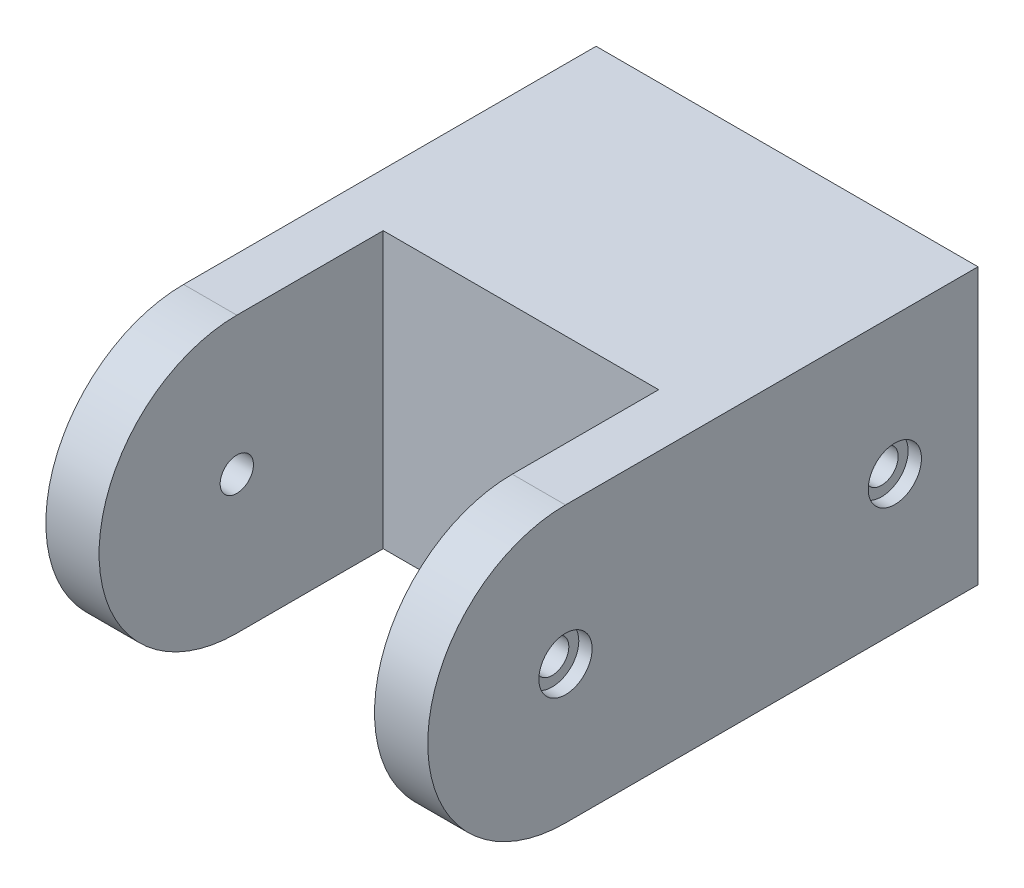
ISO-10303-21;
HEADER;
FILE_DESCRIPTION(('STEP AP214'),'2;1');
FILE_NAME('part.step','',(''),(''),'','','');
FILE_SCHEMA(('AUTOMOTIVE_DESIGN { 1 0 10303 214 1 1 1 1 }'));
ENDSEC;
DATA;
#1=APPLICATION_CONTEXT('core data for automotive mechanical design processes');
#2=APPLICATION_PROTOCOL_DEFINITION('international standard','automotive_design',2000,#1);
#3=PRODUCT_CONTEXT('',#1,'mechanical');
#4=PRODUCT('Part','Part','',(#3));
#5=PRODUCT_RELATED_PRODUCT_CATEGORY('part','',(#4));
#6=PRODUCT_DEFINITION_FORMATION('','',#4);
#7=PRODUCT_DEFINITION_CONTEXT('part definition',#1,'design');
#8=PRODUCT_DEFINITION('design','',#6,#7);
#9=PRODUCT_DEFINITION_SHAPE('','',#8);
#10=(LENGTH_UNIT() NAMED_UNIT(*) SI_UNIT(.MILLI.,.METRE.));
#11=(NAMED_UNIT(*) PLANE_ANGLE_UNIT() SI_UNIT($,.RADIAN.));
#12=(NAMED_UNIT(*) SI_UNIT($,.STERADIAN.) SOLID_ANGLE_UNIT());
#13=UNCERTAINTY_MEASURE_WITH_UNIT(LENGTH_MEASURE(1.E-05),#10,'distance_accuracy_value','');
#14=(GEOMETRIC_REPRESENTATION_CONTEXT(3) GLOBAL_UNCERTAINTY_ASSIGNED_CONTEXT((#13)) GLOBAL_UNIT_ASSIGNED_CONTEXT((#10,
#11,#12)) REPRESENTATION_CONTEXT('',''));
#15=CARTESIAN_POINT('',(0.,0.,0.));
#16=DIRECTION('',(0.,0.,1.));
#17=DIRECTION('',(1.,0.,0.));
#18=AXIS2_PLACEMENT_3D('',#15,#16,#17);
#19=CARTESIAN_POINT('',(-35.7710678118655,0.,62.));
#20=DIRECTION('',(1.,0.,0.));
#21=DIRECTION('',(0.,0.,-1.));
#22=AXIS2_PLACEMENT_3D('',#19,#20,#21);
#23=CYLINDRICAL_SURFACE('',#22,2.5);
#24=CARTESIAN_POINT('',(20.7,0.,62.));
#25=DIRECTION('',(-1.,0.,0.));
#26=DIRECTION('',(0.,0.,1.));
#27=AXIS2_PLACEMENT_3D('',#24,#25,#26);
#28=CIRCLE('',#27,2.5);
#29=CARTESIAN_POINT('',(20.7,0.,64.5));
#30=VERTEX_POINT('',#29);
#31=EDGE_CURVE('E154',#30,#30,#28,.T.);
#32=ORIENTED_EDGE('',*,*,#31,.T.);
#33=EDGE_LOOP('',(#32));
#34=FACE_BOUND('',#33,.T.);
#35=CARTESIAN_POINT('',(26.7,0.,62.));
#36=DIRECTION('',(1.,0.,0.));
#37=DIRECTION('',(0.,0.,-1.));
#38=AXIS2_PLACEMENT_3D('',#35,#36,#37);
#39=CIRCLE('',#38,2.5);
#40=CARTESIAN_POINT('',(26.7,0.,59.5));
#41=VERTEX_POINT('',#40);
#42=EDGE_CURVE('E36',#41,#41,#39,.F.);
#43=ORIENTED_EDGE('',*,*,#42,.F.);
#44=EDGE_LOOP('',(#43));
#45=FACE_BOUND('',#44,.T.);
#46=ADVANCED_FACE('F32',(#34,#45),#23,.F.);
#47=CARTESIAN_POINT('',(-35.7710678118655,0.,12.5));
#48=DIRECTION('',(1.,0.,0.));
#49=DIRECTION('',(0.,0.,-1.));
#50=AXIS2_PLACEMENT_3D('',#47,#48,#49);
#51=CYLINDRICAL_SURFACE('',#50,2.5);
#52=CARTESIAN_POINT('',(12.7,0.,12.5));
#53=DIRECTION('',(-1.,0.,0.));
#54=DIRECTION('',(0.,-1.,0.));
#55=AXIS2_PLACEMENT_3D('',#52,#53,#54);
#56=CIRCLE('',#55,2.5);
#57=CARTESIAN_POINT('',(12.7,-2.5,12.5));
#58=VERTEX_POINT('',#57);
#59=EDGE_CURVE('E229',#58,#58,#56,.T.);
#60=ORIENTED_EDGE('',*,*,#59,.T.);
#61=EDGE_LOOP('',(#60));
#62=FACE_BOUND('',#61,.T.);
#63=CARTESIAN_POINT('',(26.7,0.,12.5));
#64=DIRECTION('',(1.,0.,0.));
#65=DIRECTION('',(0.,0.,-1.));
#66=AXIS2_PLACEMENT_3D('',#63,#64,#65);
#67=CIRCLE('',#66,2.5);
#68=CARTESIAN_POINT('',(26.7,0.,10.));
#69=VERTEX_POINT('',#68);
#70=EDGE_CURVE('E239',#69,#69,#67,.F.);
#71=ORIENTED_EDGE('',*,*,#70,.F.);
#72=EDGE_LOOP('',(#71));
#73=FACE_BOUND('',#72,.T.);
#74=ADVANCED_FACE('F302',(#62,#73),#51,.F.);
#75=CARTESIAN_POINT('',(-20.7,0.,62.));
#76=DIRECTION('',(1.,0.,0.));
#77=DIRECTION('',(0.,0.,-1.));
#78=AXIS2_PLACEMENT_3D('',#75,#76,#77);
#79=CIRCLE('',#78,2.5);
#80=CARTESIAN_POINT('',(-20.7,0.,59.5));
#81=VERTEX_POINT('',#80);
#82=EDGE_CURVE('E226',#81,#81,#79,.T.);
#83=ORIENTED_EDGE('',*,*,#82,.T.);
#84=EDGE_LOOP('',(#83));
#85=FACE_BOUND('',#84,.T.);
#86=CARTESIAN_POINT('',(-26.7,0.,62.));
#87=DIRECTION('',(-1.,0.,0.));
#88=DIRECTION('',(0.,0.,1.));
#89=AXIS2_PLACEMENT_3D('',#86,#87,#88);
#90=CIRCLE('',#89,2.5);
#91=CARTESIAN_POINT('',(-26.7,0.,64.5));
#92=VERTEX_POINT('',#91);
#93=EDGE_CURVE('E233',#92,#92,#90,.F.);
#94=ORIENTED_EDGE('',*,*,#93,.F.);
#95=EDGE_LOOP('',(#94));
#96=FACE_BOUND('',#95,.T.);
#97=ADVANCED_FACE('F305',(#85,#96),#23,.F.);
#98=CARTESIAN_POINT('',(-12.7,0.,12.5));
#99=DIRECTION('',(1.,0.,0.));
#100=DIRECTION('',(0.,1.,0.));
#101=AXIS2_PLACEMENT_3D('',#98,#99,#100);
#102=CIRCLE('',#101,2.5);
#103=CARTESIAN_POINT('',(-12.7,2.5,12.5));
#104=VERTEX_POINT('',#103);
#105=EDGE_CURVE('E230',#104,#104,#102,.T.);
#106=ORIENTED_EDGE('',*,*,#105,.T.);
#107=EDGE_LOOP('',(#106));
#108=FACE_BOUND('',#107,.T.);
#109=CARTESIAN_POINT('',(-26.7,0.,12.5));
#110=DIRECTION('',(-1.,0.,0.));
#111=DIRECTION('',(0.,0.,1.));
#112=AXIS2_PLACEMENT_3D('',#109,#110,#111);
#113=CIRCLE('',#112,2.5);
#114=CARTESIAN_POINT('',(-26.7,0.,15.));
#115=VERTEX_POINT('',#114);
#116=EDGE_CURVE('E234',#115,#115,#113,.F.);
#117=ORIENTED_EDGE('',*,*,#116,.F.);
#118=EDGE_LOOP('',(#117));
#119=FACE_BOUND('',#118,.T.);
#120=ADVANCED_FACE('F311',(#108,#119),#51,.F.);
#121=CARTESIAN_POINT('',(0.,0.,40.));
#122=DIRECTION('',(0.,0.,1.));
#123=DIRECTION('',(1.,0.,0.));
#124=AXIS2_PLACEMENT_3D('',#121,#122,#123);
#125=PLANE('',#124);
#126=DIRECTION('',(0.,-1.,0.));
#127=VECTOR('',#126,1.);
#128=CARTESIAN_POINT('',(-20.7,20.7,40.));
#129=LINE('',#128,#127);
#130=CARTESIAN_POINT('',(-20.7,20.7,40.));
#131=VERTEX_POINT('',#130);
#132=CARTESIAN_POINT('',(-20.7,-20.7,40.));
#133=VERTEX_POINT('',#132);
#134=EDGE_CURVE('E136',#131,#133,#129,.T.);
#135=ORIENTED_EDGE('',*,*,#134,.T.);
#136=DIRECTION('',(1.,0.,0.));
#137=VECTOR('',#136,1.);
#138=CARTESIAN_POINT('',(-28.7,-20.7,40.));
#139=LINE('',#138,#137);
#140=CARTESIAN_POINT('',(20.7,-20.7,40.));
#141=VERTEX_POINT('',#140);
#142=EDGE_CURVE('E126',#133,#141,#139,.T.);
#143=ORIENTED_EDGE('',*,*,#142,.T.);
#144=DIRECTION('',(0.,1.,0.));
#145=VECTOR('',#144,1.);
#146=CARTESIAN_POINT('',(20.7,-20.7,40.));
#147=LINE('',#146,#145);
#148=CARTESIAN_POINT('',(20.7,20.7,40.));
#149=VERTEX_POINT('',#148);
#150=EDGE_CURVE('E161',#141,#149,#147,.T.);
#151=ORIENTED_EDGE('',*,*,#150,.T.);
#152=DIRECTION('',(-1.,0.,0.));
#153=VECTOR('',#152,1.);
#154=CARTESIAN_POINT('',(-28.7,20.7,40.));
#155=LINE('',#154,#153);
#156=EDGE_CURVE('E49',#149,#131,#155,.T.);
#157=ORIENTED_EDGE('',*,*,#156,.T.);
#158=EDGE_LOOP('',(#135,#143,#151,#157));
#159=FACE_BOUND('',#158,.T.);
#160=ADVANCED_FACE('F137',(#159),#125,.T.);
#161=CARTESIAN_POINT('',(0.,0.,0.));
#162=DIRECTION('',(0.,0.,1.));
#163=DIRECTION('',(1.,0.,0.));
#164=AXIS2_PLACEMENT_3D('',#161,#162,#163);
#165=PLANE('',#164);
#166=DIRECTION('',(0.,1.,0.));
#167=VECTOR('',#166,1.);
#168=CARTESIAN_POINT('',(28.7,20.7,0.));
#169=LINE('',#168,#167);
#170=CARTESIAN_POINT('',(28.7,-20.7,0.));
#171=VERTEX_POINT('',#170);
#172=CARTESIAN_POINT('',(28.7,20.7,0.));
#173=VERTEX_POINT('',#172);
#174=EDGE_CURVE('E209',#171,#173,#169,.T.);
#175=ORIENTED_EDGE('',*,*,#174,.F.);
#176=DIRECTION('',(1.,0.,0.));
#177=VECTOR('',#176,1.);
#178=CARTESIAN_POINT('',(-28.7,-20.7,0.));
#179=LINE('',#178,#177);
#180=CARTESIAN_POINT('',(-28.7,-20.7,0.));
#181=VERTEX_POINT('',#180);
#182=EDGE_CURVE('E216',#181,#171,#179,.T.);
#183=ORIENTED_EDGE('',*,*,#182,.F.);
#184=DIRECTION('',(0.,-1.,0.));
#185=VECTOR('',#184,1.);
#186=CARTESIAN_POINT('',(-28.7,20.7,0.));
#187=LINE('',#186,#185);
#188=CARTESIAN_POINT('',(-28.7,20.7,0.));
#189=VERTEX_POINT('',#188);
#190=EDGE_CURVE('E214',#189,#181,#187,.T.);
#191=ORIENTED_EDGE('',*,*,#190,.F.);
#192=DIRECTION('',(-1.,0.,0.));
#193=VECTOR('',#192,1.);
#194=CARTESIAN_POINT('',(-28.7,20.7,0.));
#195=LINE('',#194,#193);
#196=EDGE_CURVE('E212',#173,#189,#195,.T.);
#197=ORIENTED_EDGE('',*,*,#196,.F.);
#198=EDGE_LOOP('',(#175,#183,#191,#197));
#199=FACE_BOUND('',#198,.T.);
#200=DIRECTION('',(0.,1.,0.));
#201=VECTOR('',#200,1.);
#202=CARTESIAN_POINT('',(12.7,12.7,0.));
#203=LINE('',#202,#201);
#204=CARTESIAN_POINT('',(12.7,-12.7,0.));
#205=VERTEX_POINT('',#204);
#206=CARTESIAN_POINT('',(12.7,12.7,0.));
#207=VERTEX_POINT('',#206);
#208=EDGE_CURVE('E134',#205,#207,#203,.T.);
#209=ORIENTED_EDGE('',*,*,#208,.T.);
#210=DIRECTION('',(-1.,0.,0.));
#211=VECTOR('',#210,1.);
#212=CARTESIAN_POINT('',(-12.7,12.7,0.));
#213=LINE('',#212,#211);
#214=CARTESIAN_POINT('',(-12.7,12.7,0.));
#215=VERTEX_POINT('',#214);
#216=EDGE_CURVE('E192',#207,#215,#213,.T.);
#217=ORIENTED_EDGE('',*,*,#216,.T.);
#218=DIRECTION('',(0.,-1.,0.));
#219=VECTOR('',#218,1.);
#220=CARTESIAN_POINT('',(-12.7,12.7,0.));
#221=LINE('',#220,#219);
#222=CARTESIAN_POINT('',(-12.7,-12.7,0.));
#223=VERTEX_POINT('',#222);
#224=EDGE_CURVE('E195',#215,#223,#221,.T.);
#225=ORIENTED_EDGE('',*,*,#224,.T.);
#226=DIRECTION('',(1.,0.,0.));
#227=VECTOR('',#226,1.);
#228=CARTESIAN_POINT('',(-12.7,-12.7,0.));
#229=LINE('',#228,#227);
#230=EDGE_CURVE('E180',#223,#205,#229,.T.);
#231=ORIENTED_EDGE('',*,*,#230,.T.);
#232=EDGE_LOOP('',(#209,#217,#225,#231));
#233=FACE_BOUND('',#232,.T.);
#234=ADVANCED_FACE('F283',(#199,#233),#165,.F.);
#235=CARTESIAN_POINT('',(28.7,20.7,30.));
#236=DIRECTION('',(-1.,0.,0.));
#237=DIRECTION('',(0.,0.,1.));
#238=AXIS2_PLACEMENT_3D('',#235,#236,#237);
#239=PLANE('',#238);
#240=CARTESIAN_POINT('',(28.7,0.,62.));
#241=DIRECTION('',(1.,0.,0.));
#242=DIRECTION('',(0.,0.,-1.));
#243=AXIS2_PLACEMENT_3D('',#240,#241,#242);
#244=CIRCLE('',#243,4.00000000000001);
#245=CARTESIAN_POINT('',(28.7,0.,58.));
#246=VERTEX_POINT('',#245);
#247=EDGE_CURVE('E247',#246,#246,#244,.T.);
#248=ORIENTED_EDGE('',*,*,#247,.F.);
#249=EDGE_LOOP('',(#248));
#250=FACE_BOUND('',#249,.T.);
#251=CARTESIAN_POINT('',(28.7,0.,12.5));
#252=DIRECTION('',(1.,0.,0.));
#253=DIRECTION('',(0.,0.,-1.));
#254=AXIS2_PLACEMENT_3D('',#251,#252,#253);
#255=CIRCLE('',#254,4.);
#256=CARTESIAN_POINT('',(28.7,0.,8.5));
#257=VERTEX_POINT('',#256);
#258=EDGE_CURVE('E257',#257,#257,#255,.T.);
#259=ORIENTED_EDGE('',*,*,#258,.F.);
#260=EDGE_LOOP('',(#259));
#261=FACE_BOUND('',#260,.T.);
#262=ORIENTED_EDGE('',*,*,#174,.T.);
#263=DIRECTION('',(0.,0.,-1.));
#264=VECTOR('',#263,1.);
#265=CARTESIAN_POINT('',(28.7,20.7,30.));
#266=LINE('',#265,#264);
#267=CARTESIAN_POINT('',(28.7,20.7,62.));
#268=VERTEX_POINT('',#267);
#269=EDGE_CURVE('E11',#268,#173,#266,.T.);
#270=ORIENTED_EDGE('',*,*,#269,.F.);
#271=CARTESIAN_POINT('',(28.7,0.,62.));
#272=DIRECTION('',(1.,0.,0.));
#273=DIRECTION('',(0.,0.,1.));
#274=AXIS2_PLACEMENT_3D('',#271,#272,#273);
#275=CIRCLE('',#274,20.7);
#276=CARTESIAN_POINT('',(28.7,-20.7,62.));
#277=VERTEX_POINT('',#276);
#278=EDGE_CURVE('E158',#268,#277,#275,.T.);
#279=ORIENTED_EDGE('',*,*,#278,.T.);
#280=DIRECTION('',(0.,0.,-1.));
#281=VECTOR('',#280,1.);
#282=CARTESIAN_POINT('',(28.7,-20.7,30.));
#283=LINE('',#282,#281);
#284=EDGE_CURVE('E218',#277,#171,#283,.T.);
#285=ORIENTED_EDGE('',*,*,#284,.T.);
#286=EDGE_LOOP('',(#262,#270,#279,#285));
#287=FACE_BOUND('',#286,.T.);
#288=ADVANCED_FACE('F34',(#250,#261,#287),#239,.F.);
#289=CARTESIAN_POINT('',(-28.7,20.7,30.));
#290=DIRECTION('',(0.,-1.,0.));
#291=DIRECTION('',(0.,0.,-1.));
#292=AXIS2_PLACEMENT_3D('',#289,#290,#291);
#293=PLANE('',#292);
#294=ORIENTED_EDGE('',*,*,#196,.T.);
#295=DIRECTION('',(0.,0.,-1.));
#296=VECTOR('',#295,1.);
#297=CARTESIAN_POINT('',(-28.7,20.7,30.));
#298=LINE('',#297,#296);
#299=CARTESIAN_POINT('',(-28.7,20.7,62.));
#300=VERTEX_POINT('',#299);
#301=EDGE_CURVE('E41',#300,#189,#298,.T.);
#302=ORIENTED_EDGE('',*,*,#301,.F.);
#303=DIRECTION('',(-1.,0.,0.));
#304=VECTOR('',#303,1.);
#305=CARTESIAN_POINT('',(-20.7,20.7,62.));
#306=LINE('',#305,#304);
#307=CARTESIAN_POINT('',(-20.7,20.7,62.));
#308=VERTEX_POINT('',#307);
#309=EDGE_CURVE('E155',#308,#300,#306,.T.);
#310=ORIENTED_EDGE('',*,*,#309,.F.);
#311=DIRECTION('',(0.,0.,-1.));
#312=VECTOR('',#311,1.);
#313=CARTESIAN_POINT('',(-20.7,20.7,40.));
#314=LINE('',#313,#312);
#315=EDGE_CURVE('E141',#308,#131,#314,.T.);
#316=ORIENTED_EDGE('',*,*,#315,.T.);
#317=ORIENTED_EDGE('',*,*,#156,.F.);
#318=DIRECTION('',(0.,0.,1.));
#319=VECTOR('',#318,1.);
#320=CARTESIAN_POINT('',(20.7,20.7,40.));
#321=LINE('',#320,#319);
#322=CARTESIAN_POINT('',(20.7,20.7,62.));
#323=VERTEX_POINT('',#322);
#324=EDGE_CURVE('E57',#149,#323,#321,.T.);
#325=ORIENTED_EDGE('',*,*,#324,.T.);
#326=DIRECTION('',(1.,0.,0.));
#327=VECTOR('',#326,1.);
#328=CARTESIAN_POINT('',(20.7,20.7,62.));
#329=LINE('',#328,#327);
#330=EDGE_CURVE('E167',#323,#268,#329,.T.);
#331=ORIENTED_EDGE('',*,*,#330,.T.);
#332=ORIENTED_EDGE('',*,*,#269,.T.);
#333=EDGE_LOOP('',(#294,#302,#310,#316,#317,#325,#331,#332));
#334=FACE_BOUND('',#333,.T.);
#335=ADVANCED_FACE('F274',(#334),#293,.F.);
#336=CARTESIAN_POINT('',(-28.7,20.7,30.));
#337=DIRECTION('',(1.,0.,0.));
#338=DIRECTION('',(0.,0.,-1.));
#339=AXIS2_PLACEMENT_3D('',#336,#337,#338);
#340=PLANE('',#339);
#341=CARTESIAN_POINT('',(-28.7,0.,62.));
#342=DIRECTION('',(-1.,0.,0.));
#343=DIRECTION('',(0.,0.,1.));
#344=AXIS2_PLACEMENT_3D('',#341,#342,#343);
#345=CIRCLE('',#344,4.00000000000001);
#346=CARTESIAN_POINT('',(-28.7,0.,66.));
#347=VERTEX_POINT('',#346);
#348=EDGE_CURVE('E262',#347,#347,#345,.T.);
#349=ORIENTED_EDGE('',*,*,#348,.F.);
#350=EDGE_LOOP('',(#349));
#351=FACE_BOUND('',#350,.T.);
#352=CARTESIAN_POINT('',(-28.7,0.,12.5));
#353=DIRECTION('',(-1.,0.,0.));
#354=DIRECTION('',(0.,0.,1.));
#355=AXIS2_PLACEMENT_3D('',#352,#353,#354);
#356=CIRCLE('',#355,4.);
#357=CARTESIAN_POINT('',(-28.7,0.,16.5));
#358=VERTEX_POINT('',#357);
#359=EDGE_CURVE('E245',#358,#358,#356,.T.);
#360=ORIENTED_EDGE('',*,*,#359,.F.);
#361=EDGE_LOOP('',(#360));
#362=FACE_BOUND('',#361,.T.);
#363=ORIENTED_EDGE('',*,*,#190,.T.);
#364=DIRECTION('',(0.,0.,-1.));
#365=VECTOR('',#364,1.);
#366=CARTESIAN_POINT('',(-28.7,-20.7,30.));
#367=LINE('',#366,#365);
#368=CARTESIAN_POINT('',(-28.7,-20.7,62.));
#369=VERTEX_POINT('',#368);
#370=EDGE_CURVE('E221',#369,#181,#367,.T.);
#371=ORIENTED_EDGE('',*,*,#370,.F.);
#372=CARTESIAN_POINT('',(-28.7,0.,62.));
#373=DIRECTION('',(-1.,0.,0.));
#374=DIRECTION('',(0.,0.,-1.));
#375=AXIS2_PLACEMENT_3D('',#372,#373,#374);
#376=CIRCLE('',#375,20.7);
#377=EDGE_CURVE('E151',#369,#300,#376,.T.);
#378=ORIENTED_EDGE('',*,*,#377,.T.);
#379=ORIENTED_EDGE('',*,*,#301,.T.);
#380=EDGE_LOOP('',(#363,#371,#378,#379));
#381=FACE_BOUND('',#380,.T.);
#382=ADVANCED_FACE('F357',(#351,#362,#381),#340,.F.);
#383=CARTESIAN_POINT('',(-28.7,-20.7,30.));
#384=DIRECTION('',(0.,1.,0.));
#385=DIRECTION('',(0.,0.,1.));
#386=AXIS2_PLACEMENT_3D('',#383,#384,#385);
#387=PLANE('',#386);
#388=ORIENTED_EDGE('',*,*,#182,.T.);
#389=ORIENTED_EDGE('',*,*,#284,.F.);
#390=DIRECTION('',(1.,0.,0.));
#391=VECTOR('',#390,1.);
#392=CARTESIAN_POINT('',(20.7,-20.7,62.));
#393=LINE('',#392,#391);
#394=CARTESIAN_POINT('',(20.7,-20.7,62.));
#395=VERTEX_POINT('',#394);
#396=EDGE_CURVE('E170',#395,#277,#393,.T.);
#397=ORIENTED_EDGE('',*,*,#396,.F.);
#398=DIRECTION('',(0.,0.,-1.));
#399=VECTOR('',#398,1.);
#400=CARTESIAN_POINT('',(20.7,-20.7,40.));
#401=LINE('',#400,#399);
#402=EDGE_CURVE('E133',#395,#141,#401,.T.);
#403=ORIENTED_EDGE('',*,*,#402,.T.);
#404=ORIENTED_EDGE('',*,*,#142,.F.);
#405=DIRECTION('',(0.,0.,1.));
#406=VECTOR('',#405,1.);
#407=CARTESIAN_POINT('',(-20.7,-20.7,40.));
#408=LINE('',#407,#406);
#409=CARTESIAN_POINT('',(-20.7,-20.7,62.));
#410=VERTEX_POINT('',#409);
#411=EDGE_CURVE('E130',#133,#410,#408,.T.);
#412=ORIENTED_EDGE('',*,*,#411,.T.);
#413=DIRECTION('',(-1.,0.,0.));
#414=VECTOR('',#413,1.);
#415=CARTESIAN_POINT('',(-20.7,-20.7,62.));
#416=LINE('',#415,#414);
#417=EDGE_CURVE('E147',#410,#369,#416,.T.);
#418=ORIENTED_EDGE('',*,*,#417,.T.);
#419=ORIENTED_EDGE('',*,*,#370,.T.);
#420=EDGE_LOOP('',(#388,#389,#397,#403,#404,#412,#418,#419));
#421=FACE_BOUND('',#420,.T.);
#422=ADVANCED_FACE('F127',(#421),#387,.F.);
#423=CARTESIAN_POINT('',(12.7,12.7,30.));
#424=DIRECTION('',(-1.,0.,0.));
#425=DIRECTION('',(0.,-1.,0.));
#426=AXIS2_PLACEMENT_3D('',#423,#424,#425);
#427=PLANE('',#426);
#428=ORIENTED_EDGE('',*,*,#59,.F.);
#429=EDGE_LOOP('',(#428));
#430=FACE_BOUND('',#429,.T.);
#431=ORIENTED_EDGE('',*,*,#208,.F.);
#432=DIRECTION('',(0.,0.,-1.));
#433=VECTOR('',#432,1.);
#434=CARTESIAN_POINT('',(12.7,-12.7,30.));
#435=LINE('',#434,#433);
#436=CARTESIAN_POINT('',(12.7,-12.7,30.));
#437=VERTEX_POINT('',#436);
#438=EDGE_CURVE('E189',#437,#205,#435,.T.);
#439=ORIENTED_EDGE('',*,*,#438,.F.);
#440=DIRECTION('',(0.,1.,0.));
#441=VECTOR('',#440,1.);
#442=CARTESIAN_POINT('',(12.7,12.7,30.));
#443=LINE('',#442,#441);
#444=CARTESIAN_POINT('',(12.7,12.7,30.));
#445=VERTEX_POINT('',#444);
#446=EDGE_CURVE('E176',#437,#445,#443,.T.);
#447=ORIENTED_EDGE('',*,*,#446,.T.);
#448=DIRECTION('',(0.,0.,-1.));
#449=VECTOR('',#448,1.);
#450=CARTESIAN_POINT('',(12.7,12.7,30.));
#451=LINE('',#450,#449);
#452=EDGE_CURVE('E206',#445,#207,#451,.T.);
#453=ORIENTED_EDGE('',*,*,#452,.T.);
#454=EDGE_LOOP('',(#431,#439,#447,#453));
#455=FACE_BOUND('',#454,.T.);
#456=ADVANCED_FACE('F365',(#430,#455),#427,.T.);
#457=CARTESIAN_POINT('',(-12.7,12.7,30.));
#458=DIRECTION('',(0.,-1.,0.));
#459=DIRECTION('',(0.,0.,-1.));
#460=AXIS2_PLACEMENT_3D('',#457,#458,#459);
#461=PLANE('',#460);
#462=ORIENTED_EDGE('',*,*,#216,.F.);
#463=ORIENTED_EDGE('',*,*,#452,.F.);
#464=DIRECTION('',(-1.,0.,0.));
#465=VECTOR('',#464,1.);
#466=CARTESIAN_POINT('',(-12.7,12.7,30.));
#467=LINE('',#466,#465);
#468=CARTESIAN_POINT('',(-12.7,12.7,30.));
#469=VERTEX_POINT('',#468);
#470=EDGE_CURVE('E179',#445,#469,#467,.T.);
#471=ORIENTED_EDGE('',*,*,#470,.T.);
#472=DIRECTION('',(0.,0.,-1.));
#473=VECTOR('',#472,1.);
#474=CARTESIAN_POINT('',(-12.7,12.7,30.));
#475=LINE('',#474,#473);
#476=EDGE_CURVE('E204',#469,#215,#475,.T.);
#477=ORIENTED_EDGE('',*,*,#476,.T.);
#478=EDGE_LOOP('',(#462,#463,#471,#477));
#479=FACE_BOUND('',#478,.T.);
#480=ADVANCED_FACE('F373',(#479),#461,.T.);
#481=CARTESIAN_POINT('',(-12.7,12.7,30.));
#482=DIRECTION('',(1.,0.,0.));
#483=DIRECTION('',(0.,1.,0.));
#484=AXIS2_PLACEMENT_3D('',#481,#482,#483);
#485=PLANE('',#484);
#486=ORIENTED_EDGE('',*,*,#105,.F.);
#487=EDGE_LOOP('',(#486));
#488=FACE_BOUND('',#487,.T.);
#489=ORIENTED_EDGE('',*,*,#224,.F.);
#490=ORIENTED_EDGE('',*,*,#476,.F.);
#491=DIRECTION('',(0.,-1.,0.));
#492=VECTOR('',#491,1.);
#493=CARTESIAN_POINT('',(-12.7,12.7,30.));
#494=LINE('',#493,#492);
#495=CARTESIAN_POINT('',(-12.7,-12.7,30.));
#496=VERTEX_POINT('',#495);
#497=EDGE_CURVE('E183',#469,#496,#494,.T.);
#498=ORIENTED_EDGE('',*,*,#497,.T.);
#499=DIRECTION('',(0.,0.,-1.));
#500=VECTOR('',#499,1.);
#501=CARTESIAN_POINT('',(-12.7,-12.7,30.));
#502=LINE('',#501,#500);
#503=EDGE_CURVE('E202',#496,#223,#502,.T.);
#504=ORIENTED_EDGE('',*,*,#503,.T.);
#505=EDGE_LOOP('',(#489,#490,#498,#504));
#506=FACE_BOUND('',#505,.T.);
#507=ADVANCED_FACE('F377',(#488,#506),#485,.T.);
#508=CARTESIAN_POINT('',(-12.7,-12.7,30.));
#509=DIRECTION('',(0.,1.,0.));
#510=DIRECTION('',(0.,0.,1.));
#511=AXIS2_PLACEMENT_3D('',#508,#509,#510);
#512=PLANE('',#511);
#513=ORIENTED_EDGE('',*,*,#230,.F.);
#514=ORIENTED_EDGE('',*,*,#503,.F.);
#515=DIRECTION('',(1.,0.,0.));
#516=VECTOR('',#515,1.);
#517=CARTESIAN_POINT('',(-12.7,-12.7,30.));
#518=LINE('',#517,#516);
#519=EDGE_CURVE('E186',#496,#437,#518,.T.);
#520=ORIENTED_EDGE('',*,*,#519,.T.);
#521=ORIENTED_EDGE('',*,*,#438,.T.);
#522=EDGE_LOOP('',(#513,#514,#520,#521));
#523=FACE_BOUND('',#522,.T.);
#524=ADVANCED_FACE('F381',(#523),#512,.T.);
#525=CARTESIAN_POINT('',(0.,0.,30.));
#526=DIRECTION('',(0.,0.,1.));
#527=DIRECTION('',(1.,0.,0.));
#528=AXIS2_PLACEMENT_3D('',#525,#526,#527);
#529=PLANE('',#528);
#530=ORIENTED_EDGE('',*,*,#470,.F.);
#531=ORIENTED_EDGE('',*,*,#446,.F.);
#532=ORIENTED_EDGE('',*,*,#519,.F.);
#533=ORIENTED_EDGE('',*,*,#497,.F.);
#534=EDGE_LOOP('',(#530,#531,#532,#533));
#535=FACE_BOUND('',#534,.T.);
#536=ADVANCED_FACE('F298',(#535),#529,.F.);
#537=CARTESIAN_POINT('',(20.7,0.,62.));
#538=DIRECTION('',(1.,0.,0.));
#539=DIRECTION('',(0.,0.,-1.));
#540=AXIS2_PLACEMENT_3D('',#537,#538,#539);
#541=CYLINDRICAL_SURFACE('',#540,20.7);
#542=ORIENTED_EDGE('',*,*,#278,.F.);
#543=ORIENTED_EDGE('',*,*,#330,.F.);
#544=CARTESIAN_POINT('',(20.7,0.,62.));
#545=DIRECTION('',(1.,0.,0.));
#546=DIRECTION('',(0.,0.,1.));
#547=AXIS2_PLACEMENT_3D('',#544,#545,#546);
#548=CIRCLE('',#547,20.7);
#549=EDGE_CURVE('E164',#323,#395,#548,.T.);
#550=ORIENTED_EDGE('',*,*,#549,.T.);
#551=ORIENTED_EDGE('',*,*,#396,.T.);
#552=EDGE_LOOP('',(#542,#543,#550,#551));
#553=FACE_BOUND('',#552,.T.);
#554=ADVANCED_FACE('F288',(#553),#541,.T.);
#555=CARTESIAN_POINT('',(20.7,0.,62.));
#556=DIRECTION('',(-1.,0.,0.));
#557=DIRECTION('',(0.,0.,1.));
#558=AXIS2_PLACEMENT_3D('',#555,#556,#557);
#559=PLANE('',#558);
#560=ORIENTED_EDGE('',*,*,#31,.F.);
#561=EDGE_LOOP('',(#560));
#562=FACE_BOUND('',#561,.T.);
#563=ORIENTED_EDGE('',*,*,#402,.F.);
#564=ORIENTED_EDGE('',*,*,#549,.F.);
#565=ORIENTED_EDGE('',*,*,#324,.F.);
#566=ORIENTED_EDGE('',*,*,#150,.F.);
#567=EDGE_LOOP('',(#563,#564,#565,#566));
#568=FACE_BOUND('',#567,.T.);
#569=ADVANCED_FACE('F289',(#562,#568),#559,.T.);
#570=CARTESIAN_POINT('',(-20.7,0.,62.));
#571=DIRECTION('',(-1.,0.,0.));
#572=DIRECTION('',(0.,0.,1.));
#573=AXIS2_PLACEMENT_3D('',#570,#571,#572);
#574=CYLINDRICAL_SURFACE('',#573,20.7);
#575=ORIENTED_EDGE('',*,*,#377,.F.);
#576=ORIENTED_EDGE('',*,*,#417,.F.);
#577=CARTESIAN_POINT('',(-20.7,0.,62.));
#578=DIRECTION('',(-1.,0.,0.));
#579=DIRECTION('',(0.,0.,-1.));
#580=AXIS2_PLACEMENT_3D('',#577,#578,#579);
#581=CIRCLE('',#580,20.7);
#582=EDGE_CURVE('E145',#410,#308,#581,.T.);
#583=ORIENTED_EDGE('',*,*,#582,.T.);
#584=ORIENTED_EDGE('',*,*,#309,.T.);
#585=EDGE_LOOP('',(#575,#576,#583,#584));
#586=FACE_BOUND('',#585,.T.);
#587=ADVANCED_FACE('F277',(#586),#574,.T.);
#588=CARTESIAN_POINT('',(-20.7,0.,62.));
#589=DIRECTION('',(1.,0.,0.));
#590=DIRECTION('',(0.,0.,-1.));
#591=AXIS2_PLACEMENT_3D('',#588,#589,#590);
#592=PLANE('',#591);
#593=ORIENTED_EDGE('',*,*,#82,.F.);
#594=EDGE_LOOP('',(#593));
#595=FACE_BOUND('',#594,.T.);
#596=ORIENTED_EDGE('',*,*,#315,.F.);
#597=ORIENTED_EDGE('',*,*,#582,.F.);
#598=ORIENTED_EDGE('',*,*,#411,.F.);
#599=ORIENTED_EDGE('',*,*,#134,.F.);
#600=EDGE_LOOP('',(#596,#597,#598,#599));
#601=FACE_BOUND('',#600,.T.);
#602=ADVANCED_FACE('F143',(#595,#601),#592,.T.);
#603=CARTESIAN_POINT('',(-26.7,0.,12.5));
#604=DIRECTION('',(-1.,0.,0.));
#605=DIRECTION('',(0.,0.,1.));
#606=AXIS2_PLACEMENT_3D('',#603,#604,#605);
#607=PLANE('',#606);
#608=CARTESIAN_POINT('',(-26.7,0.,12.5));
#609=DIRECTION('',(-1.,0.,0.));
#610=DIRECTION('',(0.,0.,1.));
#611=AXIS2_PLACEMENT_3D('',#608,#609,#610);
#612=CIRCLE('',#611,4.);
#613=CARTESIAN_POINT('',(-26.7,0.,16.5));
#614=VERTEX_POINT('',#613);
#615=EDGE_CURVE('E265',#614,#614,#612,.T.);
#616=ORIENTED_EDGE('',*,*,#615,.T.);
#617=EDGE_LOOP('',(#616));
#618=FACE_BOUND('',#617,.T.);
#619=ORIENTED_EDGE('',*,*,#116,.T.);
#620=EDGE_LOOP('',(#619));
#621=FACE_BOUND('',#620,.T.);
#622=ADVANCED_FACE('F337',(#618,#621),#607,.T.);
#623=CARTESIAN_POINT('',(-26.7,0.,12.5));
#624=DIRECTION('',(-1.,0.,0.));
#625=DIRECTION('',(0.,0.,1.));
#626=AXIS2_PLACEMENT_3D('',#623,#624,#625);
#627=CYLINDRICAL_SURFACE('',#626,4.);
#628=ORIENTED_EDGE('',*,*,#615,.F.);
#629=EDGE_LOOP('',(#628));
#630=FACE_BOUND('',#629,.T.);
#631=ORIENTED_EDGE('',*,*,#359,.T.);
#632=EDGE_LOOP('',(#631));
#633=FACE_BOUND('',#632,.T.);
#634=ADVANCED_FACE('F327',(#630,#633),#627,.F.);
#635=CARTESIAN_POINT('',(-26.7,0.,62.));
#636=DIRECTION('',(-1.,0.,0.));
#637=DIRECTION('',(0.,0.,1.));
#638=AXIS2_PLACEMENT_3D('',#635,#636,#637);
#639=PLANE('',#638);
#640=CARTESIAN_POINT('',(-26.7,0.,62.));
#641=DIRECTION('',(-1.,0.,0.));
#642=DIRECTION('',(0.,0.,1.));
#643=AXIS2_PLACEMENT_3D('',#640,#641,#642);
#644=CIRCLE('',#643,4.00000000000001);
#645=CARTESIAN_POINT('',(-26.7,0.,66.));
#646=VERTEX_POINT('',#645);
#647=EDGE_CURVE('E237',#646,#646,#644,.T.);
#648=ORIENTED_EDGE('',*,*,#647,.T.);
#649=EDGE_LOOP('',(#648));
#650=FACE_BOUND('',#649,.T.);
#651=ORIENTED_EDGE('',*,*,#93,.T.);
#652=EDGE_LOOP('',(#651));
#653=FACE_BOUND('',#652,.T.);
#654=ADVANCED_FACE('F324',(#650,#653),#639,.T.);
#655=CARTESIAN_POINT('',(-26.7,0.,62.));
#656=DIRECTION('',(-1.,0.,0.));
#657=DIRECTION('',(0.,0.,1.));
#658=AXIS2_PLACEMENT_3D('',#655,#656,#657);
#659=CYLINDRICAL_SURFACE('',#658,4.00000000000001);
#660=ORIENTED_EDGE('',*,*,#647,.F.);
#661=EDGE_LOOP('',(#660));
#662=FACE_BOUND('',#661,.T.);
#663=ORIENTED_EDGE('',*,*,#348,.T.);
#664=EDGE_LOOP('',(#663));
#665=FACE_BOUND('',#664,.T.);
#666=ADVANCED_FACE('F326',(#662,#665),#659,.F.);
#667=CARTESIAN_POINT('',(26.7,0.,12.5));
#668=DIRECTION('',(1.,0.,0.));
#669=DIRECTION('',(0.,0.,-1.));
#670=AXIS2_PLACEMENT_3D('',#667,#668,#669);
#671=PLANE('',#670);
#672=CARTESIAN_POINT('',(26.7,0.,12.5));
#673=DIRECTION('',(1.,0.,0.));
#674=DIRECTION('',(0.,0.,-1.));
#675=AXIS2_PLACEMENT_3D('',#672,#673,#674);
#676=CIRCLE('',#675,4.);
#677=CARTESIAN_POINT('',(26.7,0.,8.5));
#678=VERTEX_POINT('',#677);
#679=EDGE_CURVE('E252',#678,#678,#676,.T.);
#680=ORIENTED_EDGE('',*,*,#679,.T.);
#681=EDGE_LOOP('',(#680));
#682=FACE_BOUND('',#681,.T.);
#683=ORIENTED_EDGE('',*,*,#70,.T.);
#684=EDGE_LOOP('',(#683));
#685=FACE_BOUND('',#684,.T.);
#686=ADVANCED_FACE('F334',(#682,#685),#671,.T.);
#687=CARTESIAN_POINT('',(26.7,0.,12.5));
#688=DIRECTION('',(1.,0.,0.));
#689=DIRECTION('',(0.,0.,-1.));
#690=AXIS2_PLACEMENT_3D('',#687,#688,#689);
#691=CYLINDRICAL_SURFACE('',#690,4.);
#692=ORIENTED_EDGE('',*,*,#679,.F.);
#693=EDGE_LOOP('',(#692));
#694=FACE_BOUND('',#693,.T.);
#695=ORIENTED_EDGE('',*,*,#258,.T.);
#696=EDGE_LOOP('',(#695));
#697=FACE_BOUND('',#696,.T.);
#698=ADVANCED_FACE('F341',(#694,#697),#691,.F.);
#699=CARTESIAN_POINT('',(26.7,0.,62.));
#700=DIRECTION('',(1.,0.,0.));
#701=DIRECTION('',(0.,0.,-1.));
#702=AXIS2_PLACEMENT_3D('',#699,#700,#701);
#703=PLANE('',#702);
#704=CARTESIAN_POINT('',(26.7,0.,62.));
#705=DIRECTION('',(1.,0.,0.));
#706=DIRECTION('',(0.,0.,-1.));
#707=AXIS2_PLACEMENT_3D('',#704,#705,#706);
#708=CIRCLE('',#707,4.00000000000001);
#709=CARTESIAN_POINT('',(26.7,0.,58.));
#710=VERTEX_POINT('',#709);
#711=EDGE_CURVE('E241',#710,#710,#708,.T.);
#712=ORIENTED_EDGE('',*,*,#711,.T.);
#713=EDGE_LOOP('',(#712));
#714=FACE_BOUND('',#713,.T.);
#715=ORIENTED_EDGE('',*,*,#42,.T.);
#716=EDGE_LOOP('',(#715));
#717=FACE_BOUND('',#716,.T.);
#718=ADVANCED_FACE('F510',(#714,#717),#703,.T.);
#719=CARTESIAN_POINT('',(26.7,0.,62.));
#720=DIRECTION('',(1.,0.,0.));
#721=DIRECTION('',(0.,0.,-1.));
#722=AXIS2_PLACEMENT_3D('',#719,#720,#721);
#723=CYLINDRICAL_SURFACE('',#722,4.00000000000001);
#724=ORIENTED_EDGE('',*,*,#711,.F.);
#725=EDGE_LOOP('',(#724));
#726=FACE_BOUND('',#725,.T.);
#727=ORIENTED_EDGE('',*,*,#247,.T.);
#728=EDGE_LOOP('',(#727));
#729=FACE_BOUND('',#728,.T.);
#730=ADVANCED_FACE('F518',(#726,#729),#723,.F.);
#731=CLOSED_SHELL('',(#46,#74,#97,#120,#160,#234,#288,#335,#382,#422,#456,#480,#507,#524,#536,
#554,#569,#587,#602,#622,#634,#654,#666,#686,#698,#718,#730));
#732=MANIFOLD_SOLID_BREP('B2',#731);
#733=ADVANCED_BREP_SHAPE_REPRESENTATION('',(#18,#732),#14);
#734=SHAPE_DEFINITION_REPRESENTATION(#9,#733);
ENDSEC;
END-ISO-10303-21;
